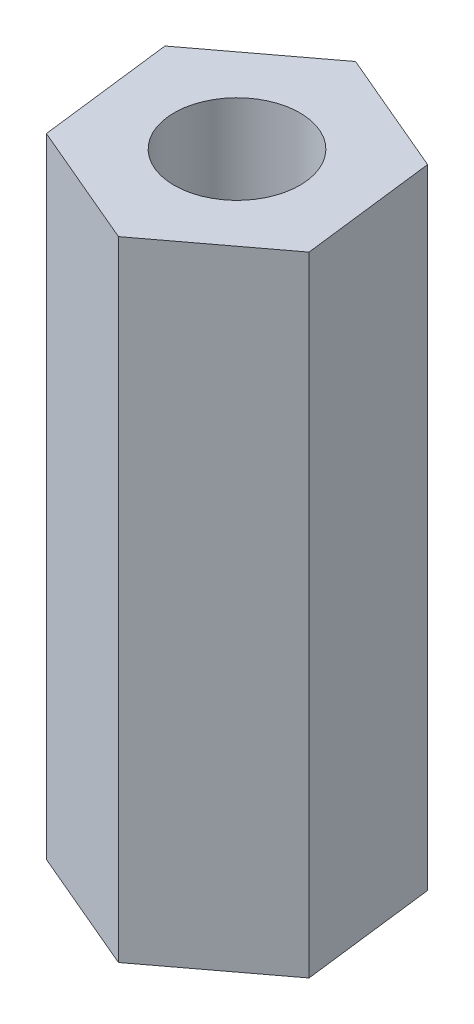
ISO-10303-21;
HEADER;
FILE_DESCRIPTION(('STEP AP214'),'2;1');
FILE_NAME('part.step','',(''),(''),'','','');
FILE_SCHEMA(('AUTOMOTIVE_DESIGN { 1 0 10303 214 1 1 1 1 }'));
ENDSEC;
DATA;
#1=APPLICATION_CONTEXT('core data for automotive mechanical design processes');
#2=APPLICATION_PROTOCOL_DEFINITION('international standard','automotive_design',2000,#1);
#3=PRODUCT_CONTEXT('',#1,'mechanical');
#4=PRODUCT('Part','Part','',(#3));
#5=PRODUCT_RELATED_PRODUCT_CATEGORY('part','',(#4));
#6=PRODUCT_DEFINITION_FORMATION('','',#4);
#7=PRODUCT_DEFINITION_CONTEXT('part definition',#1,'design');
#8=PRODUCT_DEFINITION('design','',#6,#7);
#9=PRODUCT_DEFINITION_SHAPE('','',#8);
#10=(LENGTH_UNIT() NAMED_UNIT(*) SI_UNIT(.MILLI.,.METRE.));
#11=(NAMED_UNIT(*) PLANE_ANGLE_UNIT() SI_UNIT($,.RADIAN.));
#12=(NAMED_UNIT(*) SI_UNIT($,.STERADIAN.) SOLID_ANGLE_UNIT());
#13=UNCERTAINTY_MEASURE_WITH_UNIT(LENGTH_MEASURE(1.E-05),#10,'distance_accuracy_value','');
#14=(GEOMETRIC_REPRESENTATION_CONTEXT(3) GLOBAL_UNCERTAINTY_ASSIGNED_CONTEXT((#13)) GLOBAL_UNIT_ASSIGNED_CONTEXT((#10,
#11,#12)) REPRESENTATION_CONTEXT('',''));
#15=CARTESIAN_POINT('',(0.,0.,0.));
#16=DIRECTION('',(0.,0.,1.));
#17=DIRECTION('',(1.,0.,0.));
#18=AXIS2_PLACEMENT_3D('',#15,#16,#17);
#19=CARTESIAN_POINT('',(0.,16.,0.));
#20=DIRECTION('',(0.,1.,0.));
#21=DIRECTION('',(0.,0.,1.));
#22=AXIS2_PLACEMENT_3D('',#19,#20,#21);
#23=PLANE('',#22);
#24=DIRECTION('',(-0.121573231281397,0.,-0.992582464803706));
#25=VECTOR('',#24,1.);
#26=CARTESIAN_POINT('',(3.18831840783081,16.,1.35448356589777));
#27=LINE('',#26,#25);
#28=CARTESIAN_POINT('',(3.18831840783081,16.,1.35448356589777));
#29=VERTEX_POINT('',#28);
#30=CARTESIAN_POINT('',(2.76717638099141,16.,-2.08392295358615));
#31=VERTEX_POINT('',#30);
#32=EDGE_CURVE('E130',#29,#31,#27,.T.);
#33=ORIENTED_EDGE('',*,*,#32,.T.);
#34=DIRECTION('',(-0.920388245511681,0.,-0.391005725692002));
#35=VECTOR('',#34,1.);
#36=CARTESIAN_POINT('',(2.76717638099141,16.,-2.08392295358615));
#37=LINE('',#36,#35);
#38=CARTESIAN_POINT('',(-0.421142026839402,16.,-3.43840651948392));
#39=VERTEX_POINT('',#38);
#40=EDGE_CURVE('E88',#31,#39,#37,.T.);
#41=ORIENTED_EDGE('',*,*,#40,.T.);
#42=DIRECTION('',(-0.798815014230284,0.,0.601576739111704));
#43=VECTOR('',#42,1.);
#44=CARTESIAN_POINT('',(-0.421142026839402,16.,-3.43840651948392));
#45=LINE('',#44,#43);
#46=CARTESIAN_POINT('',(-3.18831840783081,16.,-1.35448356589777));
#47=VERTEX_POINT('',#46);
#48=EDGE_CURVE('E101',#39,#47,#45,.T.);
#49=ORIENTED_EDGE('',*,*,#48,.T.);
#50=DIRECTION('',(0.121573231281397,0.,0.992582464803706));
#51=VECTOR('',#50,1.);
#52=CARTESIAN_POINT('',(-3.18831840783081,16.,-1.35448356589777));
#53=LINE('',#52,#51);
#54=CARTESIAN_POINT('',(-2.76717638099141,16.,2.08392295358615));
#55=VERTEX_POINT('',#54);
#56=EDGE_CURVE('E95',#47,#55,#53,.T.);
#57=ORIENTED_EDGE('',*,*,#56,.T.);
#58=DIRECTION('',(0.920388245511681,0.,0.391005725692002));
#59=VECTOR('',#58,1.);
#60=CARTESIAN_POINT('',(-2.76717638099141,16.,2.08392295358615));
#61=LINE('',#60,#59);
#62=CARTESIAN_POINT('',(0.421142026839401,16.,3.43840651948392));
#63=VERTEX_POINT('',#62);
#64=EDGE_CURVE('E99',#55,#63,#61,.T.);
#65=ORIENTED_EDGE('',*,*,#64,.T.);
#66=DIRECTION('',(0.798815014230284,0.,-0.601576739111704));
#67=VECTOR('',#66,1.);
#68=CARTESIAN_POINT('',(0.421142026839401,16.,3.43840651948392));
#69=LINE('',#68,#67);
#70=EDGE_CURVE('E51',#63,#29,#69,.T.);
#71=ORIENTED_EDGE('',*,*,#70,.T.);
#72=EDGE_LOOP('',(#33,#41,#49,#57,#65,#71));
#73=FACE_BOUND('',#72,.T.);
#74=CARTESIAN_POINT('',(0.,16.,0.));
#75=DIRECTION('',(0.,1.,0.));
#76=DIRECTION('',(0.,0.,1.));
#77=AXIS2_PLACEMENT_3D('',#74,#75,#76);
#78=CIRCLE('',#77,1.6);
#79=CARTESIAN_POINT('',(0.,16.,1.6));
#80=VERTEX_POINT('',#79);
#81=EDGE_CURVE('E123',#80,#80,#78,.T.);
#82=ORIENTED_EDGE('',*,*,#81,.F.);
#83=EDGE_LOOP('',(#82));
#84=FACE_BOUND('',#83,.T.);
#85=ADVANCED_FACE('F34',(#73,#84),#23,.T.);
#86=CARTESIAN_POINT('',(0.,0.,0.));
#87=DIRECTION('',(0.,1.,0.));
#88=DIRECTION('',(0.,0.,1.));
#89=AXIS2_PLACEMENT_3D('',#86,#87,#88);
#90=PLANE('',#89);
#91=DIRECTION('',(-0.121573231281397,0.,-0.992582464803706));
#92=VECTOR('',#91,1.);
#93=CARTESIAN_POINT('',(3.18831840783081,0.,1.35448356589777));
#94=LINE('',#93,#92);
#95=CARTESIAN_POINT('',(3.18831840783081,0.,1.35448356589777));
#96=VERTEX_POINT('',#95);
#97=CARTESIAN_POINT('',(2.76717638099141,0.,-2.08392295358615));
#98=VERTEX_POINT('',#97);
#99=EDGE_CURVE('E119',#96,#98,#94,.T.);
#100=ORIENTED_EDGE('',*,*,#99,.F.);
#101=DIRECTION('',(0.798815014230284,0.,-0.601576739111704));
#102=VECTOR('',#101,1.);
#103=CARTESIAN_POINT('',(0.421142026839401,0.,3.43840651948392));
#104=LINE('',#103,#102);
#105=CARTESIAN_POINT('',(0.421142026839401,0.,3.43840651948392));
#106=VERTEX_POINT('',#105);
#107=EDGE_CURVE('E80',#106,#96,#104,.T.);
#108=ORIENTED_EDGE('',*,*,#107,.F.);
#109=DIRECTION('',(0.920388245511681,0.,0.391005725692002));
#110=VECTOR('',#109,1.);
#111=CARTESIAN_POINT('',(-2.76717638099141,0.,2.08392295358615));
#112=LINE('',#111,#110);
#113=CARTESIAN_POINT('',(-2.76717638099141,0.,2.08392295358615));
#114=VERTEX_POINT('',#113);
#115=EDGE_CURVE('E74',#114,#106,#112,.T.);
#116=ORIENTED_EDGE('',*,*,#115,.F.);
#117=DIRECTION('',(0.121573231281397,0.,0.992582464803706));
#118=VECTOR('',#117,1.);
#119=CARTESIAN_POINT('',(-3.18831840783081,0.,-1.35448356589777));
#120=LINE('',#119,#118);
#121=CARTESIAN_POINT('',(-3.18831840783081,0.,-1.35448356589777));
#122=VERTEX_POINT('',#121);
#123=EDGE_CURVE('E109',#122,#114,#120,.T.);
#124=ORIENTED_EDGE('',*,*,#123,.F.);
#125=DIRECTION('',(-0.798815014230284,0.,0.601576739111704));
#126=VECTOR('',#125,1.);
#127=CARTESIAN_POINT('',(-0.421142026839402,0.,-3.43840651948392));
#128=LINE('',#127,#126);
#129=CARTESIAN_POINT('',(-0.421142026839402,0.,-3.43840651948392));
#130=VERTEX_POINT('',#129);
#131=EDGE_CURVE('E125',#130,#122,#128,.T.);
#132=ORIENTED_EDGE('',*,*,#131,.F.);
#133=DIRECTION('',(-0.920388245511681,0.,-0.391005725692002));
#134=VECTOR('',#133,1.);
#135=CARTESIAN_POINT('',(2.76717638099141,0.,-2.08392295358615));
#136=LINE('',#135,#134);
#137=EDGE_CURVE('E122',#98,#130,#136,.T.);
#138=ORIENTED_EDGE('',*,*,#137,.F.);
#139=EDGE_LOOP('',(#100,#108,#116,#124,#132,#138));
#140=FACE_BOUND('',#139,.T.);
#141=CARTESIAN_POINT('',(0.,0.,0.));
#142=DIRECTION('',(0.,1.,0.));
#143=DIRECTION('',(0.,0.,1.));
#144=AXIS2_PLACEMENT_3D('',#141,#142,#143);
#145=CIRCLE('',#144,1.6);
#146=CARTESIAN_POINT('',(0.,0.,1.6));
#147=VERTEX_POINT('',#146);
#148=EDGE_CURVE('E223',#147,#147,#145,.T.);
#149=ORIENTED_EDGE('',*,*,#148,.T.);
#150=EDGE_LOOP('',(#149));
#151=FACE_BOUND('',#150,.T.);
#152=ADVANCED_FACE('F139',(#140,#151),#90,.F.);
#153=CARTESIAN_POINT('',(3.18831840783081,16.,1.35448356589777));
#154=DIRECTION('',(-0.992582464803706,0.,0.121573231281397));
#155=DIRECTION('',(0.121573231281397,0.,0.992582464803706));
#156=AXIS2_PLACEMENT_3D('',#153,#154,#155);
#157=PLANE('',#156);
#158=ORIENTED_EDGE('',*,*,#99,.T.);
#159=DIRECTION('',(0.,-1.,0.));
#160=VECTOR('',#159,1.);
#161=CARTESIAN_POINT('',(2.76717638099141,16.,-2.08392295358615));
#162=LINE('',#161,#160);
#163=EDGE_CURVE('E11',#31,#98,#162,.T.);
#164=ORIENTED_EDGE('',*,*,#163,.F.);
#165=ORIENTED_EDGE('',*,*,#32,.F.);
#166=DIRECTION('',(0.,-1.,0.));
#167=VECTOR('',#166,1.);
#168=CARTESIAN_POINT('',(3.18831840783081,16.,1.35448356589777));
#169=LINE('',#168,#167);
#170=EDGE_CURVE('E115',#29,#96,#169,.T.);
#171=ORIENTED_EDGE('',*,*,#170,.T.);
#172=EDGE_LOOP('',(#158,#164,#165,#171));
#173=FACE_BOUND('',#172,.T.);
#174=ADVANCED_FACE('F36',(#173),#157,.F.);
#175=CARTESIAN_POINT('',(2.76717638099141,16.,-2.08392295358615));
#176=DIRECTION('',(-0.391005725692002,0.,0.920388245511681));
#177=DIRECTION('',(0.920388245511681,0.,0.391005725692002));
#178=AXIS2_PLACEMENT_3D('',#175,#176,#177);
#179=PLANE('',#178);
#180=ORIENTED_EDGE('',*,*,#137,.T.);
#181=DIRECTION('',(0.,-1.,0.));
#182=VECTOR('',#181,1.);
#183=CARTESIAN_POINT('',(-0.421142026839402,16.,-3.43840651948392));
#184=LINE('',#183,#182);
#185=EDGE_CURVE('E43',#39,#130,#184,.T.);
#186=ORIENTED_EDGE('',*,*,#185,.F.);
#187=ORIENTED_EDGE('',*,*,#40,.F.);
#188=ORIENTED_EDGE('',*,*,#163,.T.);
#189=EDGE_LOOP('',(#180,#186,#187,#188));
#190=FACE_BOUND('',#189,.T.);
#191=ADVANCED_FACE('F164',(#190),#179,.F.);
#192=CARTESIAN_POINT('',(-0.421142026839402,16.,-3.43840651948392));
#193=DIRECTION('',(0.601576739111704,0.,0.798815014230284));
#194=DIRECTION('',(0.798815014230284,0.,-0.601576739111704));
#195=AXIS2_PLACEMENT_3D('',#192,#193,#194);
#196=PLANE('',#195);
#197=ORIENTED_EDGE('',*,*,#131,.T.);
#198=DIRECTION('',(0.,-1.,0.));
#199=VECTOR('',#198,1.);
#200=CARTESIAN_POINT('',(-3.18831840783081,16.,-1.35448356589777));
#201=LINE('',#200,#199);
#202=EDGE_CURVE('E110',#47,#122,#201,.T.);
#203=ORIENTED_EDGE('',*,*,#202,.F.);
#204=ORIENTED_EDGE('',*,*,#48,.F.);
#205=ORIENTED_EDGE('',*,*,#185,.T.);
#206=EDGE_LOOP('',(#197,#203,#204,#205));
#207=FACE_BOUND('',#206,.T.);
#208=ADVANCED_FACE('F136',(#207),#196,.F.);
#209=CARTESIAN_POINT('',(-3.18831840783081,16.,-1.35448356589777));
#210=DIRECTION('',(0.992582464803706,0.,-0.121573231281397));
#211=DIRECTION('',(-0.121573231281397,0.,-0.992582464803706));
#212=AXIS2_PLACEMENT_3D('',#209,#210,#211);
#213=PLANE('',#212);
#214=ORIENTED_EDGE('',*,*,#123,.T.);
#215=DIRECTION('',(0.,-1.,0.));
#216=VECTOR('',#215,1.);
#217=CARTESIAN_POINT('',(-2.76717638099141,16.,2.08392295358615));
#218=LINE('',#217,#216);
#219=EDGE_CURVE('E106',#55,#114,#218,.T.);
#220=ORIENTED_EDGE('',*,*,#219,.F.);
#221=ORIENTED_EDGE('',*,*,#56,.F.);
#222=ORIENTED_EDGE('',*,*,#202,.T.);
#223=EDGE_LOOP('',(#214,#220,#221,#222));
#224=FACE_BOUND('',#223,.T.);
#225=ADVANCED_FACE('F107',(#224),#213,.F.);
#226=CARTESIAN_POINT('',(-2.76717638099141,16.,2.08392295358615));
#227=DIRECTION('',(0.391005725692002,0.,-0.920388245511681));
#228=DIRECTION('',(-0.920388245511681,0.,-0.391005725692002));
#229=AXIS2_PLACEMENT_3D('',#226,#227,#228);
#230=PLANE('',#229);
#231=ORIENTED_EDGE('',*,*,#115,.T.);
#232=DIRECTION('',(0.,-1.,0.));
#233=VECTOR('',#232,1.);
#234=CARTESIAN_POINT('',(0.421142026839401,16.,3.43840651948392));
#235=LINE('',#234,#233);
#236=EDGE_CURVE('E111',#63,#106,#235,.T.);
#237=ORIENTED_EDGE('',*,*,#236,.F.);
#238=ORIENTED_EDGE('',*,*,#64,.F.);
#239=ORIENTED_EDGE('',*,*,#219,.T.);
#240=EDGE_LOOP('',(#231,#237,#238,#239));
#241=FACE_BOUND('',#240,.T.);
#242=ADVANCED_FACE('F113',(#241),#230,.F.);
#243=CARTESIAN_POINT('',(0.421142026839401,16.,3.43840651948392));
#244=DIRECTION('',(-0.601576739111704,0.,-0.798815014230284));
#245=DIRECTION('',(-0.798815014230284,0.,0.601576739111704));
#246=AXIS2_PLACEMENT_3D('',#243,#244,#245);
#247=PLANE('',#246);
#248=ORIENTED_EDGE('',*,*,#107,.T.);
#249=ORIENTED_EDGE('',*,*,#170,.F.);
#250=ORIENTED_EDGE('',*,*,#70,.F.);
#251=ORIENTED_EDGE('',*,*,#236,.T.);
#252=EDGE_LOOP('',(#248,#249,#250,#251));
#253=FACE_BOUND('',#252,.T.);
#254=ADVANCED_FACE('F144',(#253),#247,.F.);
#255=CARTESIAN_POINT('',(0.,16.,0.));
#256=DIRECTION('',(0.,-1.,0.));
#257=DIRECTION('',(0.,0.,-1.));
#258=AXIS2_PLACEMENT_3D('',#255,#256,#257);
#259=CYLINDRICAL_SURFACE('',#258,1.6);
#260=ORIENTED_EDGE('',*,*,#81,.T.);
#261=EDGE_LOOP('',(#260));
#262=FACE_BOUND('',#261,.T.);
#263=ORIENTED_EDGE('',*,*,#148,.F.);
#264=EDGE_LOOP('',(#263));
#265=FACE_BOUND('',#264,.T.);
#266=ADVANCED_FACE('F146',(#262,#265),#259,.F.);
#267=CLOSED_SHELL('',(#85,#152,#174,#191,#208,#225,#242,#254,#266));
#268=MANIFOLD_SOLID_BREP('B2',#267);
#269=ADVANCED_BREP_SHAPE_REPRESENTATION('',(#18,#268),#14);
#270=SHAPE_DEFINITION_REPRESENTATION(#9,#269);
ENDSEC;
END-ISO-10303-21;
